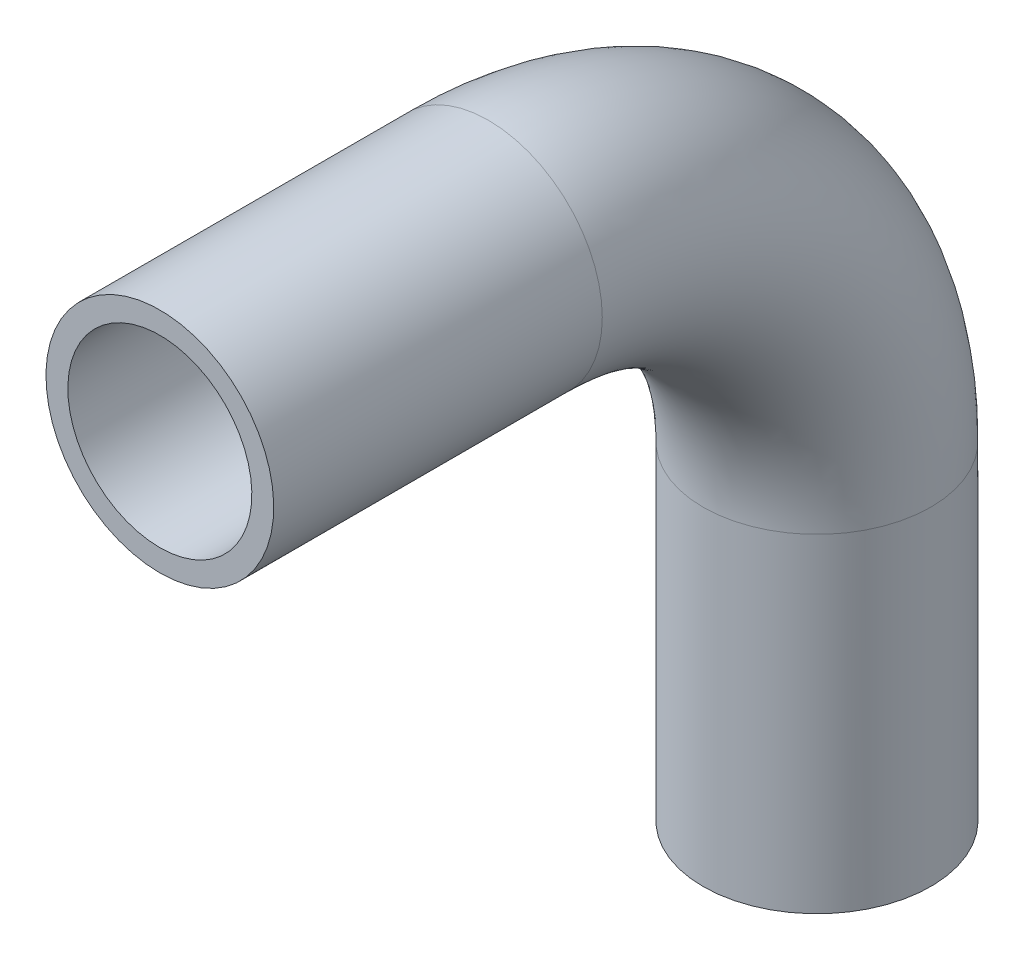
ISO-10303-21;
HEADER;
FILE_DESCRIPTION(('STEP AP214'),'2;1');
FILE_NAME('part.step','',(''),(''),'','','');
FILE_SCHEMA(('AUTOMOTIVE_DESIGN { 1 0 10303 214 1 1 1 1 }'));
ENDSEC;
DATA;
#1=APPLICATION_CONTEXT('core data for automotive mechanical design processes');
#2=APPLICATION_PROTOCOL_DEFINITION('international standard','automotive_design',2000,#1);
#3=PRODUCT_CONTEXT('',#1,'mechanical');
#4=PRODUCT('Part','Part','',(#3));
#5=PRODUCT_RELATED_PRODUCT_CATEGORY('part','',(#4));
#6=PRODUCT_DEFINITION_FORMATION('','',#4);
#7=PRODUCT_DEFINITION_CONTEXT('part definition',#1,'design');
#8=PRODUCT_DEFINITION('design','',#6,#7);
#9=PRODUCT_DEFINITION_SHAPE('','',#8);
#10=(LENGTH_UNIT() NAMED_UNIT(*) SI_UNIT(.MILLI.,.METRE.));
#11=(NAMED_UNIT(*) PLANE_ANGLE_UNIT() SI_UNIT($,.RADIAN.));
#12=(NAMED_UNIT(*) SI_UNIT($,.STERADIAN.) SOLID_ANGLE_UNIT());
#13=UNCERTAINTY_MEASURE_WITH_UNIT(LENGTH_MEASURE(1.E-05),#10,'distance_accuracy_value','');
#14=(GEOMETRIC_REPRESENTATION_CONTEXT(3) GLOBAL_UNCERTAINTY_ASSIGNED_CONTEXT((#13)) GLOBAL_UNIT_ASSIGNED_CONTEXT((#10,
#11,#12)) REPRESENTATION_CONTEXT('',''));
#15=CARTESIAN_POINT('',(0.,0.,0.));
#16=DIRECTION('',(0.,0.,1.));
#17=DIRECTION('',(1.,0.,0.));
#18=AXIS2_PLACEMENT_3D('',#15,#16,#17);
#19=CARTESIAN_POINT('',(0.,0.,0.));
#20=DIRECTION('',(0.,1.,0.));
#21=DIRECTION('',(0.,0.,1.));
#22=AXIS2_PLACEMENT_3D('',#19,#20,#21);
#23=PLANE('',#22);
#24=CARTESIAN_POINT('',(0.,0.,0.));
#25=DIRECTION('',(0.,1.,0.));
#26=DIRECTION('',(0.,0.,1.));
#27=AXIS2_PLACEMENT_3D('',#24,#25,#26);
#28=CIRCLE('',#27,5.334);
#29=CARTESIAN_POINT('',(0.,0.,5.334));
#30=VERTEX_POINT('',#29);
#31=EDGE_CURVE('E56',#30,#30,#28,.T.);
#32=ORIENTED_EDGE('',*,*,#31,.T.);
#33=EDGE_LOOP('',(#32));
#34=FACE_BOUND('',#33,.T.);
#35=CARTESIAN_POINT('',(0.,0.,0.));
#36=DIRECTION('',(0.,1.,0.));
#37=DIRECTION('',(0.,0.,1.));
#38=AXIS2_PLACEMENT_3D('',#35,#36,#37);
#39=CIRCLE('',#38,6.604);
#40=CARTESIAN_POINT('',(0.,0.,6.604));
#41=VERTEX_POINT('',#40);
#42=EDGE_CURVE('E47',#41,#41,#39,.T.);
#43=ORIENTED_EDGE('',*,*,#42,.F.);
#44=EDGE_LOOP('',(#43));
#45=FACE_BOUND('',#44,.T.);
#46=ADVANCED_FACE('F33',(#34,#45),#23,.F.);
#47=CARTESIAN_POINT('',(0.,38.1,38.1));
#48=DIRECTION('',(0.,0.,1.));
#49=DIRECTION('',(0.,-1.,0.));
#50=AXIS2_PLACEMENT_3D('',#47,#48,#49);
#51=PLANE('',#50);
#52=CARTESIAN_POINT('',(0.,38.1,38.1));
#53=DIRECTION('',(0.,0.,1.));
#54=DIRECTION('',(0.,-1.,0.));
#55=AXIS2_PLACEMENT_3D('',#52,#53,#54);
#56=CIRCLE('',#55,5.334);
#57=CARTESIAN_POINT('',(0.,32.766,38.1));
#58=VERTEX_POINT('',#57);
#59=EDGE_CURVE('E52',#58,#58,#56,.T.);
#60=ORIENTED_EDGE('',*,*,#59,.F.);
#61=EDGE_LOOP('',(#60));
#62=FACE_BOUND('',#61,.T.);
#63=CARTESIAN_POINT('',(0.,38.1,38.1));
#64=DIRECTION('',(0.,0.,1.));
#65=DIRECTION('',(0.,-1.,0.));
#66=AXIS2_PLACEMENT_3D('',#63,#64,#65);
#67=CIRCLE('',#66,6.604);
#68=CARTESIAN_POINT('',(0.,31.496,38.1));
#69=VERTEX_POINT('',#68);
#70=EDGE_CURVE('E10',#69,#69,#67,.T.);
#71=ORIENTED_EDGE('',*,*,#70,.T.);
#72=EDGE_LOOP('',(#71));
#73=FACE_BOUND('',#72,.T.);
#74=ADVANCED_FACE('F92',(#62,#73),#51,.T.);
#75=CARTESIAN_POINT('',(0.,0.,0.));
#76=DIRECTION('',(0.,1.,0.));
#77=DIRECTION('',(0.,0.,1.));
#78=AXIS2_PLACEMENT_3D('',#75,#76,#77);
#79=CYLINDRICAL_SURFACE('',#78,6.604);
#80=CARTESIAN_POINT('',(0.,19.0499999999999,0.));
#81=DIRECTION('',(0.,1.,0.));
#82=DIRECTION('',(0.,0.,1.));
#83=AXIS2_PLACEMENT_3D('',#80,#81,#82);
#84=CIRCLE('',#83,6.604);
#85=CARTESIAN_POINT('',(0.,19.0499999999998,-6.604));
#86=VERTEX_POINT('',#85);
#87=EDGE_CURVE('E43',#86,#86,#84,.T.);
#88=ORIENTED_EDGE('',*,*,#87,.F.);
#89=EDGE_LOOP('',(#88));
#90=FACE_BOUND('',#89,.T.);
#91=ORIENTED_EDGE('',*,*,#42,.T.);
#92=EDGE_LOOP('',(#91));
#93=FACE_BOUND('',#92,.T.);
#94=ADVANCED_FACE('F88',(#90,#93),#79,.T.);
#95=CARTESIAN_POINT('',(0.,19.05,19.05));
#96=DIRECTION('',(1.,0.,0.));
#97=DIRECTION('',(0.,0.,-1.));
#98=AXIS2_PLACEMENT_3D('',#95,#96,#97);
#99=TOROIDAL_SURFACE('',#98,19.05,6.604);
#100=CARTESIAN_POINT('',(0.,38.1,19.0500000000001));
#101=DIRECTION('',(0.,0.,1.));
#102=DIRECTION('',(0.,-1.,0.));
#103=AXIS2_PLACEMENT_3D('',#100,#101,#102);
#104=CIRCLE('',#103,6.604);
#105=CARTESIAN_POINT('',(0.,44.704,19.0500000000002));
#106=VERTEX_POINT('',#105);
#107=EDGE_CURVE('E39',#106,#106,#104,.T.);
#108=CARTESIAN_POINT('',(0.,19.05,19.05));
#109=DIRECTION('',(1.,0.,0.));
#110=DIRECTION('',(0.,0.,-1.));
#111=AXIS2_PLACEMENT_3D('',#108,#109,#110);
#112=CIRCLE('',#111,25.654);
#113=EDGE_CURVE('',#86,#106,#112,.T.);
#114=ORIENTED_EDGE('',*,*,#87,.T.);
#115=ORIENTED_EDGE('',*,*,#107,.F.);
#116=ORIENTED_EDGE('',*,*,#113,.T.);
#117=ORIENTED_EDGE('',*,*,#113,.F.);
#118=EDGE_LOOP('',(#114,#116,#115,#117));
#119=FACE_BOUND('',#118,.T.);
#120=ADVANCED_FACE('F82',(#119),#99,.T.);
#121=CARTESIAN_POINT('',(0.,38.1,19.0500000000001));
#122=DIRECTION('',(0.,0.,1.));
#123=DIRECTION('',(0.,-1.,0.));
#124=AXIS2_PLACEMENT_3D('',#121,#122,#123);
#125=CYLINDRICAL_SURFACE('',#124,6.604);
#126=ORIENTED_EDGE('',*,*,#70,.F.);
#127=EDGE_LOOP('',(#126));
#128=FACE_BOUND('',#127,.T.);
#129=ORIENTED_EDGE('',*,*,#107,.T.);
#130=EDGE_LOOP('',(#129));
#131=FACE_BOUND('',#130,.T.);
#132=ADVANCED_FACE('F79',(#128,#131),#125,.T.);
#133=CARTESIAN_POINT('',(0.,0.,0.));
#134=DIRECTION('',(0.,1.,0.));
#135=DIRECTION('',(0.,0.,1.));
#136=AXIS2_PLACEMENT_3D('',#133,#134,#135);
#137=CYLINDRICAL_SURFACE('',#136,5.334);
#138=CARTESIAN_POINT('',(0.,19.0499999999999,0.));
#139=DIRECTION('',(0.,-1.,0.));
#140=DIRECTION('',(0.,0.,-1.));
#141=AXIS2_PLACEMENT_3D('',#138,#139,#140);
#142=CIRCLE('',#141,5.334);
#143=CARTESIAN_POINT('',(0.,19.0499999999999,-5.334));
#144=VERTEX_POINT('',#143);
#145=EDGE_CURVE('E59',#144,#144,#142,.F.);
#146=ORIENTED_EDGE('',*,*,#145,.T.);
#147=EDGE_LOOP('',(#146));
#148=FACE_BOUND('',#147,.T.);
#149=ORIENTED_EDGE('',*,*,#31,.F.);
#150=EDGE_LOOP('',(#149));
#151=FACE_BOUND('',#150,.T.);
#152=ADVANCED_FACE('F65',(#148,#151),#137,.F.);
#153=CARTESIAN_POINT('',(0.,19.05,19.05));
#154=DIRECTION('',(1.,0.,0.));
#155=DIRECTION('',(0.,0.,-1.));
#156=AXIS2_PLACEMENT_3D('',#153,#154,#155);
#157=TOROIDAL_SURFACE('',#156,19.05,5.334);
#158=CARTESIAN_POINT('',(0.,38.1,19.0500000000001));
#159=DIRECTION('',(0.,0.,1.));
#160=DIRECTION('',(0.,-1.,0.));
#161=AXIS2_PLACEMENT_3D('',#158,#159,#160);
#162=CIRCLE('',#161,5.334);
#163=CARTESIAN_POINT('',(0.,43.434,19.0500000000001));
#164=VERTEX_POINT('',#163);
#165=EDGE_CURVE('E55',#164,#164,#162,.T.);
#166=CARTESIAN_POINT('',(0.,19.05,19.05));
#167=DIRECTION('',(1.,0.,0.));
#168=DIRECTION('',(0.,0.,-1.));
#169=AXIS2_PLACEMENT_3D('',#166,#167,#168);
#170=CIRCLE('',#169,24.384);
#171=EDGE_CURVE('',#144,#164,#170,.T.);
#172=ORIENTED_EDGE('',*,*,#145,.F.);
#173=ORIENTED_EDGE('',*,*,#165,.T.);
#174=ORIENTED_EDGE('',*,*,#171,.T.);
#175=ORIENTED_EDGE('',*,*,#171,.F.);
#176=EDGE_LOOP('',(#172,#174,#173,#175));
#177=FACE_BOUND('',#176,.T.);
#178=ADVANCED_FACE('F68',(#177),#157,.F.);
#179=CARTESIAN_POINT('',(0.,38.1,19.0500000000001));
#180=DIRECTION('',(0.,0.,1.));
#181=DIRECTION('',(0.,-1.,0.));
#182=AXIS2_PLACEMENT_3D('',#179,#180,#181);
#183=CYLINDRICAL_SURFACE('',#182,5.334);
#184=ORIENTED_EDGE('',*,*,#59,.T.);
#185=EDGE_LOOP('',(#184));
#186=FACE_BOUND('',#185,.T.);
#187=ORIENTED_EDGE('',*,*,#165,.F.);
#188=EDGE_LOOP('',(#187));
#189=FACE_BOUND('',#188,.T.);
#190=ADVANCED_FACE('F70',(#186,#189),#183,.F.);
#191=CLOSED_SHELL('',(#46,#74,#94,#120,#132,#152,#178,#190));
#192=MANIFOLD_SOLID_BREP('B2',#191);
#193=ADVANCED_BREP_SHAPE_REPRESENTATION('',(#18,#192),#14);
#194=SHAPE_DEFINITION_REPRESENTATION(#9,#193);
ENDSEC;
END-ISO-10303-21;
